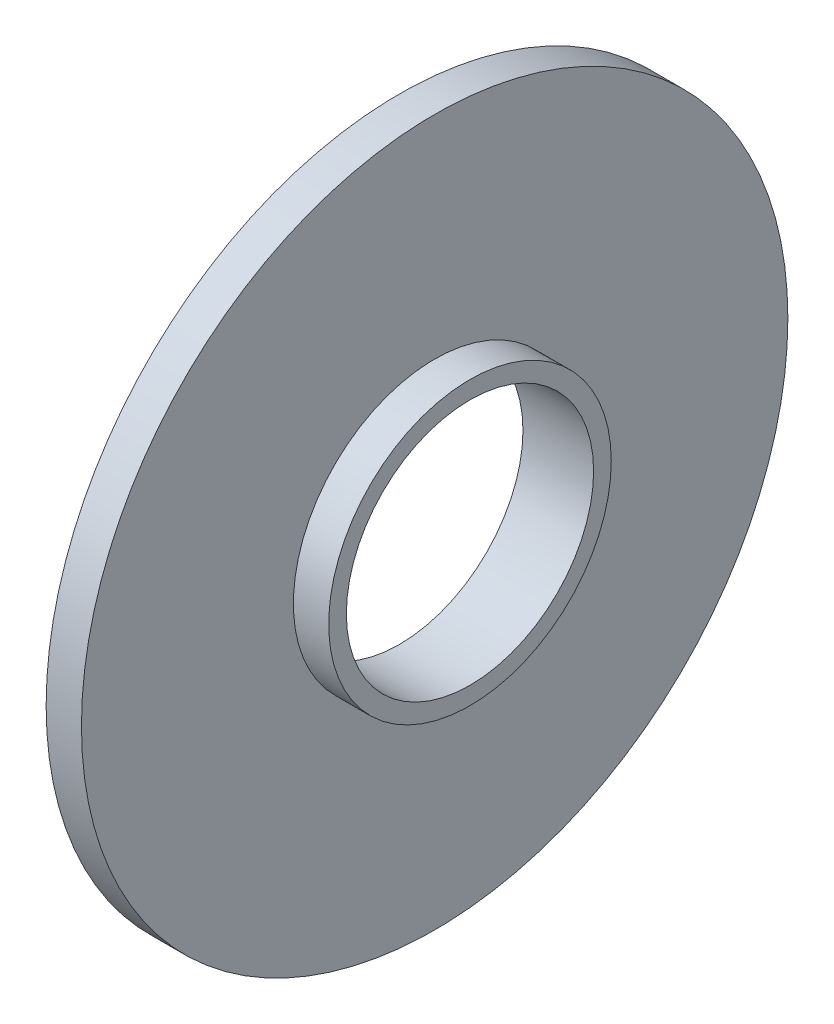
ISO-10303-21;
HEADER;
FILE_DESCRIPTION(('STEP AP214'),'2;1');
FILE_NAME('part.step','',(''),(''),'','','');
FILE_SCHEMA(('AUTOMOTIVE_DESIGN { 1 0 10303 214 1 1 1 1 }'));
ENDSEC;
DATA;
#1=APPLICATION_CONTEXT('core data for automotive mechanical design processes');
#2=APPLICATION_PROTOCOL_DEFINITION('international standard','automotive_design',2000,#1);
#3=PRODUCT_CONTEXT('',#1,'mechanical');
#4=PRODUCT('Part','Part','',(#3));
#5=PRODUCT_RELATED_PRODUCT_CATEGORY('part','',(#4));
#6=PRODUCT_DEFINITION_FORMATION('','',#4);
#7=PRODUCT_DEFINITION_CONTEXT('part definition',#1,'design');
#8=PRODUCT_DEFINITION('design','',#6,#7);
#9=PRODUCT_DEFINITION_SHAPE('','',#8);
#10=(LENGTH_UNIT() NAMED_UNIT(*) SI_UNIT(.MILLI.,.METRE.));
#11=(NAMED_UNIT(*) PLANE_ANGLE_UNIT() SI_UNIT($,.RADIAN.));
#12=(NAMED_UNIT(*) SI_UNIT($,.STERADIAN.) SOLID_ANGLE_UNIT());
#13=UNCERTAINTY_MEASURE_WITH_UNIT(LENGTH_MEASURE(1.E-05),#10,'distance_accuracy_value','');
#14=(GEOMETRIC_REPRESENTATION_CONTEXT(3) GLOBAL_UNCERTAINTY_ASSIGNED_CONTEXT((#13)) GLOBAL_UNIT_ASSIGNED_CONTEXT((#10,
#11,#12)) REPRESENTATION_CONTEXT('',''));
#15=CARTESIAN_POINT('',(0.,0.,0.));
#16=DIRECTION('',(0.,0.,1.));
#17=DIRECTION('',(1.,0.,0.));
#18=AXIS2_PLACEMENT_3D('',#15,#16,#17);
#19=CARTESIAN_POINT('',(1.,0.,0.));
#20=DIRECTION('',(1.,0.,0.));
#21=DIRECTION('',(0.,0.,-1.));
#22=AXIS2_PLACEMENT_3D('',#19,#20,#21);
#23=PLANE('',#22);
#24=CARTESIAN_POINT('',(1.,0.,0.));
#25=DIRECTION('',(1.,0.,0.));
#26=DIRECTION('',(0.,0.,-1.));
#27=AXIS2_PLACEMENT_3D('',#24,#25,#26);
#28=CIRCLE('',#27,10.);
#29=CARTESIAN_POINT('',(1.,0.,-10.));
#30=VERTEX_POINT('',#29);
#31=EDGE_CURVE('E10',#30,#30,#28,.T.);
#32=ORIENTED_EDGE('',*,*,#31,.T.);
#33=EDGE_LOOP('',(#32));
#34=FACE_BOUND('',#33,.T.);
#35=CARTESIAN_POINT('',(1.,0.,0.));
#36=DIRECTION('',(1.,0.,0.));
#37=DIRECTION('',(0.,0.,-1.));
#38=AXIS2_PLACEMENT_3D('',#35,#36,#37);
#39=CIRCLE('',#38,4.);
#40=CARTESIAN_POINT('',(1.,0.,-4.));
#41=VERTEX_POINT('',#40);
#42=EDGE_CURVE('E48',#41,#41,#39,.T.);
#43=ORIENTED_EDGE('',*,*,#42,.F.);
#44=EDGE_LOOP('',(#43));
#45=FACE_BOUND('',#44,.T.);
#46=ADVANCED_FACE('F32',(#34,#45),#23,.T.);
#47=CARTESIAN_POINT('',(0.,0.,0.));
#48=DIRECTION('',(1.,0.,0.));
#49=DIRECTION('',(0.,0.,-1.));
#50=AXIS2_PLACEMENT_3D('',#47,#48,#49);
#51=PLANE('',#50);
#52=CARTESIAN_POINT('',(0.,0.,0.));
#53=DIRECTION('',(1.,0.,0.));
#54=DIRECTION('',(0.,0.,-1.));
#55=AXIS2_PLACEMENT_3D('',#52,#53,#54);
#56=CIRCLE('',#55,10.);
#57=CARTESIAN_POINT('',(0.,0.,-10.));
#58=VERTEX_POINT('',#57);
#59=EDGE_CURVE('E36',#58,#58,#56,.T.);
#60=ORIENTED_EDGE('',*,*,#59,.F.);
#61=EDGE_LOOP('',(#60));
#62=FACE_BOUND('',#61,.T.);
#63=CARTESIAN_POINT('',(0.,0.,0.));
#64=DIRECTION('',(1.,0.,0.));
#65=DIRECTION('',(0.,0.,-1.));
#66=AXIS2_PLACEMENT_3D('',#63,#64,#65);
#67=CIRCLE('',#66,3.5);
#68=CARTESIAN_POINT('',(0.,0.,-3.5));
#69=VERTEX_POINT('',#68);
#70=EDGE_CURVE('E43',#69,#69,#67,.T.);
#71=ORIENTED_EDGE('',*,*,#70,.T.);
#72=EDGE_LOOP('',(#71));
#73=FACE_BOUND('',#72,.T.);
#74=ADVANCED_FACE('F73',(#62,#73),#51,.F.);
#75=CARTESIAN_POINT('',(1.,0.,0.));
#76=DIRECTION('',(-1.,0.,0.));
#77=DIRECTION('',(0.,0.,1.));
#78=AXIS2_PLACEMENT_3D('',#75,#76,#77);
#79=CYLINDRICAL_SURFACE('',#78,10.);
#80=ORIENTED_EDGE('',*,*,#31,.F.);
#81=EDGE_LOOP('',(#80));
#82=FACE_BOUND('',#81,.T.);
#83=ORIENTED_EDGE('',*,*,#59,.T.);
#84=EDGE_LOOP('',(#83));
#85=FACE_BOUND('',#84,.T.);
#86=ADVANCED_FACE('F34',(#82,#85),#79,.T.);
#87=CARTESIAN_POINT('',(1.,0.,0.));
#88=DIRECTION('',(-1.,0.,0.));
#89=DIRECTION('',(0.,0.,1.));
#90=AXIS2_PLACEMENT_3D('',#87,#88,#89);
#91=CYLINDRICAL_SURFACE('',#90,3.5);
#92=ORIENTED_EDGE('',*,*,#70,.F.);
#93=EDGE_LOOP('',(#92));
#94=FACE_BOUND('',#93,.T.);
#95=CARTESIAN_POINT('',(2.,0.,0.));
#96=DIRECTION('',(1.,0.,0.));
#97=DIRECTION('',(0.,0.,-1.));
#98=AXIS2_PLACEMENT_3D('',#95,#96,#97);
#99=CIRCLE('',#98,3.5);
#100=CARTESIAN_POINT('',(2.,0.,-3.5));
#101=VERTEX_POINT('',#100);
#102=EDGE_CURVE('E51',#101,#101,#99,.T.);
#103=ORIENTED_EDGE('',*,*,#102,.T.);
#104=EDGE_LOOP('',(#103));
#105=FACE_BOUND('',#104,.T.);
#106=ADVANCED_FACE('F57',(#94,#105),#91,.F.);
#107=CARTESIAN_POINT('',(2.,0.,0.));
#108=DIRECTION('',(1.,0.,0.));
#109=DIRECTION('',(0.,0.,-1.));
#110=AXIS2_PLACEMENT_3D('',#107,#108,#109);
#111=PLANE('',#110);
#112=CARTESIAN_POINT('',(2.,0.,0.));
#113=DIRECTION('',(1.,0.,0.));
#114=DIRECTION('',(0.,0.,-1.));
#115=AXIS2_PLACEMENT_3D('',#112,#113,#114);
#116=CIRCLE('',#115,4.);
#117=CARTESIAN_POINT('',(2.,0.,-4.));
#118=VERTEX_POINT('',#117);
#119=EDGE_CURVE('E47',#118,#118,#116,.T.);
#120=ORIENTED_EDGE('',*,*,#119,.T.);
#121=EDGE_LOOP('',(#120));
#122=FACE_BOUND('',#121,.T.);
#123=ORIENTED_EDGE('',*,*,#102,.F.);
#124=EDGE_LOOP('',(#123));
#125=FACE_BOUND('',#124,.T.);
#126=ADVANCED_FACE('F59',(#122,#125),#111,.T.);
#127=CARTESIAN_POINT('',(2.,0.,0.));
#128=DIRECTION('',(-1.,0.,0.));
#129=DIRECTION('',(0.,0.,1.));
#130=AXIS2_PLACEMENT_3D('',#127,#128,#129);
#131=CYLINDRICAL_SURFACE('',#130,4.);
#132=ORIENTED_EDGE('',*,*,#119,.F.);
#133=EDGE_LOOP('',(#132));
#134=FACE_BOUND('',#133,.T.);
#135=ORIENTED_EDGE('',*,*,#42,.T.);
#136=EDGE_LOOP('',(#135));
#137=FACE_BOUND('',#136,.T.);
#138=ADVANCED_FACE('F61',(#134,#137),#131,.T.);
#139=CLOSED_SHELL('',(#46,#74,#86,#106,#126,#138));
#140=MANIFOLD_SOLID_BREP('B2',#139);
#141=ADVANCED_BREP_SHAPE_REPRESENTATION('',(#18,#140),#14);
#142=SHAPE_DEFINITION_REPRESENTATION(#9,#141);
ENDSEC;
END-ISO-10303-21;
